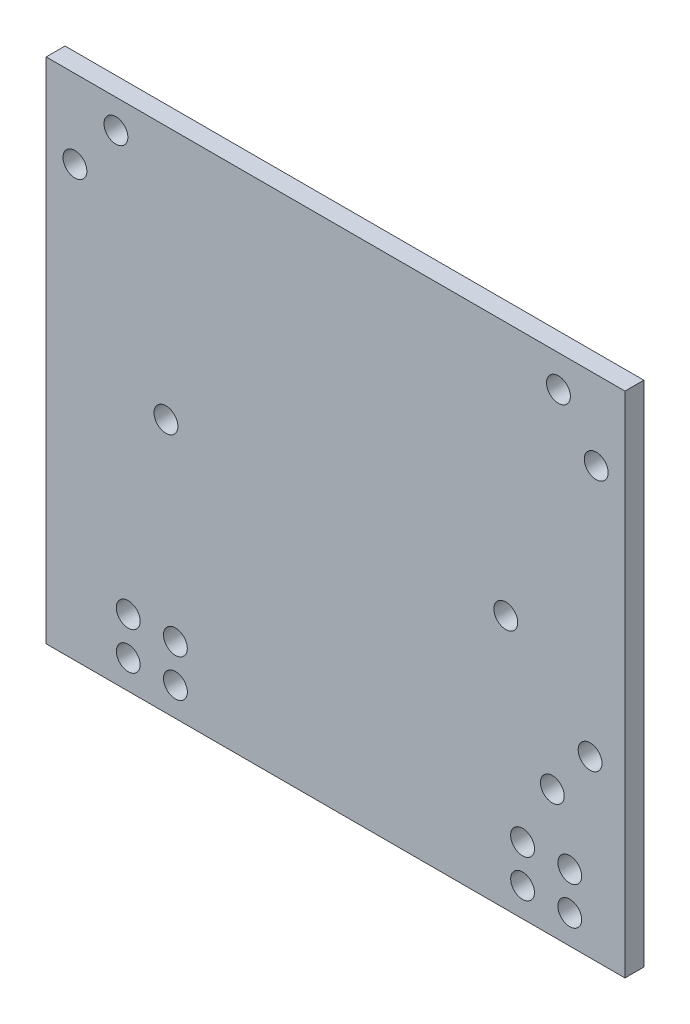
ISO-10303-21;
HEADER;
FILE_DESCRIPTION(('STEP AP214'),'2;1');
FILE_NAME('part.step','',(''),(''),'','','');
FILE_SCHEMA(('AUTOMOTIVE_DESIGN { 1 0 10303 214 1 1 1 1 }'));
ENDSEC;
DATA;
#1=APPLICATION_CONTEXT('core data for automotive mechanical design processes');
#2=APPLICATION_PROTOCOL_DEFINITION('international standard','automotive_design',2000,#1);
#3=PRODUCT_CONTEXT('',#1,'mechanical');
#4=PRODUCT('Part','Part','',(#3));
#5=PRODUCT_RELATED_PRODUCT_CATEGORY('part','',(#4));
#6=PRODUCT_DEFINITION_FORMATION('','',#4);
#7=PRODUCT_DEFINITION_CONTEXT('part definition',#1,'design');
#8=PRODUCT_DEFINITION('design','',#6,#7);
#9=PRODUCT_DEFINITION_SHAPE('','',#8);
#10=(LENGTH_UNIT() NAMED_UNIT(*) SI_UNIT(.MILLI.,.METRE.));
#11=(NAMED_UNIT(*) PLANE_ANGLE_UNIT() SI_UNIT($,.RADIAN.));
#12=(NAMED_UNIT(*) SI_UNIT($,.STERADIAN.) SOLID_ANGLE_UNIT());
#13=UNCERTAINTY_MEASURE_WITH_UNIT(LENGTH_MEASURE(1.E-05),#10,'distance_accuracy_value','');
#14=(GEOMETRIC_REPRESENTATION_CONTEXT(3) GLOBAL_UNCERTAINTY_ASSIGNED_CONTEXT((#13)) GLOBAL_UNIT_ASSIGNED_CONTEXT((#10,
#11,#12)) REPRESENTATION_CONTEXT('',''));
#15=CARTESIAN_POINT('',(0.,0.,0.));
#16=DIRECTION('',(0.,0.,1.));
#17=DIRECTION('',(1.,0.,0.));
#18=AXIS2_PLACEMENT_3D('',#15,#16,#17);
#19=CARTESIAN_POINT('',(0.,0.,-6.35));
#20=DIRECTION('',(0.,0.,1.));
#21=DIRECTION('',(-1.,0.,0.));
#22=AXIS2_PLACEMENT_3D('',#19,#20,#21);
#23=PLANE('',#22);
#24=CARTESIAN_POINT('',(889.644786871224,226.95326558584,-6.35));
#25=DIRECTION('',(0.,0.,1.));
#26=DIRECTION('',(1.,0.,0.));
#27=AXIS2_PLACEMENT_3D('',#24,#25,#26);
#28=CIRCLE('',#27,4.00150000000001);
#29=CARTESIAN_POINT('',(893.646286871224,226.95326558584,-6.35));
#30=VERTEX_POINT('',#29);
#31=EDGE_CURVE('E176',#30,#30,#28,.T.);
#32=ORIENTED_EDGE('',*,*,#31,.T.);
#33=EDGE_LOOP('',(#32));
#34=FACE_BOUND('',#33,.T.);
#35=CARTESIAN_POINT('',(1032.28657507432,260.04946558584,-6.35));
#36=DIRECTION('',(0.,0.,1.));
#37=DIRECTION('',(1.,0.,0.));
#38=AXIS2_PLACEMENT_3D('',#35,#36,#37);
#39=CIRCLE('',#38,4.00149999999977);
#40=CARTESIAN_POINT('',(1036.28807507432,260.04946558584,-6.35));
#41=VERTEX_POINT('',#40);
#42=EDGE_CURVE('E205',#41,#41,#39,.T.);
#43=ORIENTED_EDGE('',*,*,#42,.T.);
#44=EDGE_LOOP('',(#43));
#45=FACE_BOUND('',#44,.T.);
#46=CARTESIAN_POINT('',(1044.98657507432,275.92446558584,-6.35));
#47=DIRECTION('',(0.,0.,1.));
#48=DIRECTION('',(1.,0.,0.));
#49=AXIS2_PLACEMENT_3D('',#46,#47,#48);
#50=CIRCLE('',#49,4.00149999999977);
#51=CARTESIAN_POINT('',(1048.98807507432,275.92446558584,-6.35));
#52=VERTEX_POINT('',#51);
#53=EDGE_CURVE('E179',#52,#52,#50,.T.);
#54=ORIENTED_EDGE('',*,*,#53,.T.);
#55=EDGE_LOOP('',(#54));
#56=FACE_BOUND('',#55,.T.);
#57=CARTESIAN_POINT('',(1038.1549594132,239.65326558584,-6.35));
#58=DIRECTION('',(0.,0.,1.));
#59=DIRECTION('',(1.,0.,0.));
#60=AXIS2_PLACEMENT_3D('',#57,#58,#59);
#61=CIRCLE('',#60,4.00149999999978);
#62=CARTESIAN_POINT('',(1042.1564594132,239.65326558584,-6.35));
#63=VERTEX_POINT('',#62);
#64=EDGE_CURVE('E186',#63,#63,#61,.T.);
#65=ORIENTED_EDGE('',*,*,#64,.T.);
#66=EDGE_LOOP('',(#65));
#67=FACE_BOUND('',#66,.T.);
#68=CARTESIAN_POINT('',(1022.2799594132,226.95326558584,-6.35));
#69=DIRECTION('',(0.,0.,1.));
#70=DIRECTION('',(1.,0.,0.));
#71=AXIS2_PLACEMENT_3D('',#68,#69,#70);
#72=CIRCLE('',#71,4.00149999999978);
#73=CARTESIAN_POINT('',(1026.2814594132,226.95326558584,-6.35));
#74=VERTEX_POINT('',#73);
#75=EDGE_CURVE('E192',#74,#74,#72,.T.);
#76=ORIENTED_EDGE('',*,*,#75,.T.);
#77=EDGE_LOOP('',(#76));
#78=FACE_BOUND('',#77,.T.);
#79=CARTESIAN_POINT('',(905.519786871224,239.65326558584,-6.35));
#80=DIRECTION('',(0.,0.,1.));
#81=DIRECTION('',(1.,0.,0.));
#82=AXIS2_PLACEMENT_3D('',#79,#80,#81);
#83=CIRCLE('',#82,4.00150000000001);
#84=CARTESIAN_POINT('',(909.521286871224,239.65326558584,-6.35));
#85=VERTEX_POINT('',#84);
#86=EDGE_CURVE('E198',#85,#85,#83,.T.);
#87=ORIENTED_EDGE('',*,*,#86,.T.);
#88=EDGE_LOOP('',(#87));
#89=FACE_BOUND('',#88,.T.);
#90=DIRECTION('',(0.,-1.,0.));
#91=VECTOR('',#90,1.);
#92=CARTESIAN_POINT('',(862.044789876079,217.278265585855,-6.35));
#93=LINE('',#92,#91);
#94=CARTESIAN_POINT('',(862.044789876079,388.233207524856,-6.35));
#95=VERTEX_POINT('',#94);
#96=CARTESIAN_POINT('',(862.044789876079,217.278265585855,-6.35));
#97=VERTEX_POINT('',#96);
#98=EDGE_CURVE('E99',#95,#97,#93,.T.);
#99=ORIENTED_EDGE('',*,*,#98,.F.);
#100=DIRECTION('',(-1.,0.,0.));
#101=VECTOR('',#100,1.);
#102=CARTESIAN_POINT('',(862.044789876079,388.233207524856,-6.35));
#103=LINE('',#102,#101);
#104=CARTESIAN_POINT('',(1056.7178425293,388.233207524856,-6.35));
#105=VERTEX_POINT('',#104);
#106=EDGE_CURVE('E102',#105,#95,#103,.T.);
#107=ORIENTED_EDGE('',*,*,#106,.F.);
#108=DIRECTION('',(0.,1.,0.));
#109=VECTOR('',#108,1.);
#110=CARTESIAN_POINT('',(1056.7178425293,217.278265585855,-6.35));
#111=LINE('',#110,#109);
#112=CARTESIAN_POINT('',(1056.7178425293,217.278265585855,-6.35));
#113=VERTEX_POINT('',#112);
#114=EDGE_CURVE('E90',#113,#105,#111,.T.);
#115=ORIENTED_EDGE('',*,*,#114,.F.);
#116=DIRECTION('',(1.,0.,0.));
#117=VECTOR('',#116,1.);
#118=CARTESIAN_POINT('',(862.044789876079,217.278265585855,-6.35));
#119=LINE('',#118,#117);
#120=EDGE_CURVE('E95',#97,#113,#119,.T.);
#121=ORIENTED_EDGE('',*,*,#120,.F.);
#122=EDGE_LOOP('',(#99,#107,#115,#121));
#123=FACE_BOUND('',#122,.T.);
#124=CARTESIAN_POINT('',(1022.27995941321,239.653265585854,-6.35));
#125=DIRECTION('',(0.,0.,1.));
#126=DIRECTION('',(1.,0.,0.));
#127=AXIS2_PLACEMENT_3D('',#124,#125,#126);
#128=CIRCLE('',#127,4.01269999999996);
#129=CARTESIAN_POINT('',(1026.29265941321,239.653265585854,-6.35));
#130=VERTEX_POINT('',#129);
#131=EDGE_CURVE('E111',#130,#130,#128,.T.);
#132=ORIENTED_EDGE('',*,*,#131,.T.);
#133=EDGE_LOOP('',(#132));
#134=FACE_BOUND('',#133,.T.);
#135=CARTESIAN_POINT('',(1038.15495941321,226.953265585854,-6.35));
#136=DIRECTION('',(0.,0.,1.));
#137=DIRECTION('',(1.,0.,0.));
#138=AXIS2_PLACEMENT_3D('',#135,#136,#137);
#139=CIRCLE('',#138,4.01269999999996);
#140=CARTESIAN_POINT('',(1042.16765941321,226.953265585854,-6.35));
#141=VERTEX_POINT('',#140);
#142=EDGE_CURVE('E122',#141,#141,#139,.T.);
#143=ORIENTED_EDGE('',*,*,#142,.T.);
#144=EDGE_LOOP('',(#143));
#145=FACE_BOUND('',#144,.T.);
#146=CARTESIAN_POINT('',(889.644786871235,239.653265585855,-6.35));
#147=DIRECTION('',(0.,0.,1.));
#148=DIRECTION('',(1.,0.,0.));
#149=AXIS2_PLACEMENT_3D('',#146,#147,#148);
#150=CIRCLE('',#149,4.01270000000008);
#151=CARTESIAN_POINT('',(893.657486871235,239.653265585855,-6.35));
#152=VERTEX_POINT('',#151);
#153=EDGE_CURVE('E128',#152,#152,#150,.T.);
#154=ORIENTED_EDGE('',*,*,#153,.T.);
#155=EDGE_LOOP('',(#154));
#156=FACE_BOUND('',#155,.T.);
#157=CARTESIAN_POINT('',(1034.3338599261,377.480941448401,-6.35));
#158=DIRECTION('',(0.,0.,1.));
#159=DIRECTION('',(1.,0.,0.));
#160=AXIS2_PLACEMENT_3D('',#157,#158,#159);
#161=CIRCLE('',#160,4.01270000000019);
#162=CARTESIAN_POINT('',(1038.3465599261,377.480941448401,-6.35));
#163=VERTEX_POINT('',#162);
#164=EDGE_CURVE('E134',#163,#163,#161,.T.);
#165=ORIENTED_EDGE('',*,*,#164,.T.);
#166=EDGE_LOOP('',(#165));
#167=FACE_BOUND('',#166,.T.);
#168=CARTESIAN_POINT('',(1047.0428425293,361.613131700632,-6.35));
#169=DIRECTION('',(0.,0.,1.));
#170=DIRECTION('',(1.,0.,0.));
#171=AXIS2_PLACEMENT_3D('',#168,#169,#170);
#172=CIRCLE('',#171,4.01270000000019);
#173=CARTESIAN_POINT('',(1051.0555425293,361.613131700632,-6.35));
#174=VERTEX_POINT('',#173);
#175=EDGE_CURVE('E140',#174,#174,#172,.T.);
#176=ORIENTED_EDGE('',*,*,#175,.T.);
#177=EDGE_LOOP('',(#176));
#178=FACE_BOUND('',#177,.T.);
#179=CARTESIAN_POINT('',(871.719789876079,361.793284425073,-6.35));
#180=DIRECTION('',(0.,0.,1.));
#181=DIRECTION('',(1.,0.,0.));
#182=AXIS2_PLACEMENT_3D('',#179,#180,#181);
#183=CIRCLE('',#182,4.01270000000008);
#184=CARTESIAN_POINT('',(875.732489876079,361.793284425073,-6.35));
#185=VERTEX_POINT('',#184);
#186=EDGE_CURVE('E146',#185,#185,#183,.T.);
#187=ORIENTED_EDGE('',*,*,#186,.T.);
#188=EDGE_LOOP('',(#187));
#189=FACE_BOUND('',#188,.T.);
#190=CARTESIAN_POINT('',(885.505258453761,378.558207524856,-6.35));
#191=DIRECTION('',(0.,0.,1.));
#192=DIRECTION('',(1.,0.,0.));
#193=AXIS2_PLACEMENT_3D('',#190,#191,#192);
#194=CIRCLE('',#193,4.01270000000008);
#195=CARTESIAN_POINT('',(889.517958453761,378.558207524856,-6.35));
#196=VERTEX_POINT('',#195);
#197=EDGE_CURVE('E152',#196,#196,#194,.T.);
#198=ORIENTED_EDGE('',*,*,#197,.T.);
#199=EDGE_LOOP('',(#198));
#200=FACE_BOUND('',#199,.T.);
#201=CARTESIAN_POINT('',(905.519786871235,226.953265585855,-6.35));
#202=DIRECTION('',(0.,0.,1.));
#203=DIRECTION('',(1.,0.,0.));
#204=AXIS2_PLACEMENT_3D('',#201,#202,#203);
#205=CIRCLE('',#204,4.01270000000008);
#206=CARTESIAN_POINT('',(909.532486871235,226.953265585855,-6.35));
#207=VERTEX_POINT('',#206);
#208=EDGE_CURVE('E158',#207,#207,#205,.T.);
#209=ORIENTED_EDGE('',*,*,#208,.T.);
#210=EDGE_LOOP('',(#209));
#211=FACE_BOUND('',#210,.T.);
#212=CARTESIAN_POINT('',(902.338636268682,302.755736555355,-6.35));
#213=DIRECTION('',(0.,0.,1.));
#214=DIRECTION('',(1.,0.,0.));
#215=AXIS2_PLACEMENT_3D('',#212,#213,#214);
#216=CIRCLE('',#215,4.01270000000008);
#217=CARTESIAN_POINT('',(906.351336268682,302.755736555355,-6.35));
#218=VERTEX_POINT('',#217);
#219=EDGE_CURVE('E164',#218,#218,#216,.T.);
#220=ORIENTED_EDGE('',*,*,#219,.T.);
#221=EDGE_LOOP('',(#220));
#222=FACE_BOUND('',#221,.T.);
#223=CARTESIAN_POINT('',(1016.63863626868,302.755736555355,-6.35));
#224=DIRECTION('',(0.,0.,1.));
#225=DIRECTION('',(-1.,0.,0.));
#226=AXIS2_PLACEMENT_3D('',#223,#224,#225);
#227=CIRCLE('',#226,4.01270000000019);
#228=CARTESIAN_POINT('',(1012.62593626868,302.755736555355,-6.35));
#229=VERTEX_POINT('',#228);
#230=EDGE_CURVE('E170',#229,#229,#227,.T.);
#231=ORIENTED_EDGE('',*,*,#230,.T.);
#232=EDGE_LOOP('',(#231));
#233=FACE_BOUND('',#232,.T.);
#234=ADVANCED_FACE('F43',(#34,#45,#56,#67,#78,#89,#123,#134,#145,#156,#167,#178,#189,#200,#211,
#222,#233),#23,.F.);
#235=CARTESIAN_POINT('',(0.,0.,0.));
#236=DIRECTION('',(0.,0.,1.));
#237=DIRECTION('',(-1.,0.,0.));
#238=AXIS2_PLACEMENT_3D('',#235,#236,#237);
#239=PLANE('',#238);
#240=CARTESIAN_POINT('',(889.644786871224,226.95326558584,0.));
#241=DIRECTION('',(0.,0.,1.));
#242=DIRECTION('',(1.,0.,0.));
#243=AXIS2_PLACEMENT_3D('',#240,#241,#242);
#244=CIRCLE('',#243,4.00150000000001);
#245=CARTESIAN_POINT('',(893.646286871224,226.95326558584,0.));
#246=VERTEX_POINT('',#245);
#247=EDGE_CURVE('E204',#246,#246,#244,.T.);
#248=ORIENTED_EDGE('',*,*,#247,.F.);
#249=EDGE_LOOP('',(#248));
#250=FACE_BOUND('',#249,.T.);
#251=CARTESIAN_POINT('',(1032.28657507432,260.04946558584,0.));
#252=DIRECTION('',(0.,0.,1.));
#253=DIRECTION('',(1.,0.,0.));
#254=AXIS2_PLACEMENT_3D('',#251,#252,#253);
#255=CIRCLE('',#254,4.00149999999977);
#256=CARTESIAN_POINT('',(1036.28807507432,260.04946558584,0.));
#257=VERTEX_POINT('',#256);
#258=EDGE_CURVE('E183',#257,#257,#255,.T.);
#259=ORIENTED_EDGE('',*,*,#258,.F.);
#260=EDGE_LOOP('',(#259));
#261=FACE_BOUND('',#260,.T.);
#262=CARTESIAN_POINT('',(1044.98657507432,275.92446558584,0.));
#263=DIRECTION('',(0.,0.,1.));
#264=DIRECTION('',(1.,0.,0.));
#265=AXIS2_PLACEMENT_3D('',#262,#263,#264);
#266=CIRCLE('',#265,4.00149999999977);
#267=CARTESIAN_POINT('',(1048.98807507432,275.92446558584,0.));
#268=VERTEX_POINT('',#267);
#269=EDGE_CURVE('E182',#268,#268,#266,.T.);
#270=ORIENTED_EDGE('',*,*,#269,.F.);
#271=EDGE_LOOP('',(#270));
#272=FACE_BOUND('',#271,.T.);
#273=CARTESIAN_POINT('',(1038.1549594132,239.65326558584,0.));
#274=DIRECTION('',(0.,0.,1.));
#275=DIRECTION('',(1.,0.,0.));
#276=AXIS2_PLACEMENT_3D('',#273,#274,#275);
#277=CIRCLE('',#276,4.00149999999978);
#278=CARTESIAN_POINT('',(1042.1564594132,239.65326558584,0.));
#279=VERTEX_POINT('',#278);
#280=EDGE_CURVE('E189',#279,#279,#277,.T.);
#281=ORIENTED_EDGE('',*,*,#280,.F.);
#282=EDGE_LOOP('',(#281));
#283=FACE_BOUND('',#282,.T.);
#284=CARTESIAN_POINT('',(1022.2799594132,226.95326558584,0.));
#285=DIRECTION('',(0.,0.,1.));
#286=DIRECTION('',(1.,0.,0.));
#287=AXIS2_PLACEMENT_3D('',#284,#285,#286);
#288=CIRCLE('',#287,4.00149999999978);
#289=CARTESIAN_POINT('',(1026.2814594132,226.95326558584,0.));
#290=VERTEX_POINT('',#289);
#291=EDGE_CURVE('E195',#290,#290,#288,.T.);
#292=ORIENTED_EDGE('',*,*,#291,.F.);
#293=EDGE_LOOP('',(#292));
#294=FACE_BOUND('',#293,.T.);
#295=CARTESIAN_POINT('',(905.519786871224,239.65326558584,0.));
#296=DIRECTION('',(0.,0.,1.));
#297=DIRECTION('',(1.,0.,0.));
#298=AXIS2_PLACEMENT_3D('',#295,#296,#297);
#299=CIRCLE('',#298,4.00150000000001);
#300=CARTESIAN_POINT('',(909.521286871224,239.65326558584,0.));
#301=VERTEX_POINT('',#300);
#302=EDGE_CURVE('E201',#301,#301,#299,.T.);
#303=ORIENTED_EDGE('',*,*,#302,.F.);
#304=EDGE_LOOP('',(#303));
#305=FACE_BOUND('',#304,.T.);
#306=CARTESIAN_POINT('',(902.338636268682,302.755736555355,0.));
#307=DIRECTION('',(0.,0.,1.));
#308=DIRECTION('',(1.,0.,0.));
#309=AXIS2_PLACEMENT_3D('',#306,#307,#308);
#310=CIRCLE('',#309,4.01270000000008);
#311=CARTESIAN_POINT('',(906.351336268682,302.755736555355,0.));
#312=VERTEX_POINT('',#311);
#313=EDGE_CURVE('E167',#312,#312,#310,.T.);
#314=ORIENTED_EDGE('',*,*,#313,.F.);
#315=EDGE_LOOP('',(#314));
#316=FACE_BOUND('',#315,.T.);
#317=CARTESIAN_POINT('',(885.505258453761,378.558207524856,0.));
#318=DIRECTION('',(0.,0.,1.));
#319=DIRECTION('',(1.,0.,0.));
#320=AXIS2_PLACEMENT_3D('',#317,#318,#319);
#321=CIRCLE('',#320,4.01270000000008);
#322=CARTESIAN_POINT('',(889.517958453761,378.558207524856,0.));
#323=VERTEX_POINT('',#322);
#324=EDGE_CURVE('E155',#323,#323,#321,.T.);
#325=ORIENTED_EDGE('',*,*,#324,.F.);
#326=EDGE_LOOP('',(#325));
#327=FACE_BOUND('',#326,.T.);
#328=CARTESIAN_POINT('',(1047.0428425293,361.613131700632,0.));
#329=DIRECTION('',(0.,0.,1.));
#330=DIRECTION('',(1.,0.,0.));
#331=AXIS2_PLACEMENT_3D('',#328,#329,#330);
#332=CIRCLE('',#331,4.01270000000019);
#333=CARTESIAN_POINT('',(1051.0555425293,361.613131700632,0.));
#334=VERTEX_POINT('',#333);
#335=EDGE_CURVE('E143',#334,#334,#332,.T.);
#336=ORIENTED_EDGE('',*,*,#335,.F.);
#337=EDGE_LOOP('',(#336));
#338=FACE_BOUND('',#337,.T.);
#339=CARTESIAN_POINT('',(889.644786871235,239.653265585855,0.));
#340=DIRECTION('',(0.,0.,1.));
#341=DIRECTION('',(1.,0.,0.));
#342=AXIS2_PLACEMENT_3D('',#339,#340,#341);
#343=CIRCLE('',#342,4.01270000000008);
#344=CARTESIAN_POINT('',(893.657486871235,239.653265585855,0.));
#345=VERTEX_POINT('',#344);
#346=EDGE_CURVE('E131',#345,#345,#343,.T.);
#347=ORIENTED_EDGE('',*,*,#346,.F.);
#348=EDGE_LOOP('',(#347));
#349=FACE_BOUND('',#348,.T.);
#350=CARTESIAN_POINT('',(1022.27995941321,239.653265585854,0.));
#351=DIRECTION('',(0.,0.,1.));
#352=DIRECTION('',(1.,0.,0.));
#353=AXIS2_PLACEMENT_3D('',#350,#351,#352);
#354=CIRCLE('',#353,4.01269999999996);
#355=CARTESIAN_POINT('',(1026.29265941321,239.653265585854,0.));
#356=VERTEX_POINT('',#355);
#357=EDGE_CURVE('E119',#356,#356,#354,.T.);
#358=ORIENTED_EDGE('',*,*,#357,.F.);
#359=EDGE_LOOP('',(#358));
#360=FACE_BOUND('',#359,.T.);
#361=DIRECTION('',(0.,-1.,0.));
#362=VECTOR('',#361,1.);
#363=CARTESIAN_POINT('',(862.044789876079,217.278265585855,0.));
#364=LINE('',#363,#362);
#365=CARTESIAN_POINT('',(862.044789876079,388.233207524856,0.));
#366=VERTEX_POINT('',#365);
#367=CARTESIAN_POINT('',(862.044789876079,217.278265585855,0.));
#368=VERTEX_POINT('',#367);
#369=EDGE_CURVE('E107',#366,#368,#364,.T.);
#370=ORIENTED_EDGE('',*,*,#369,.T.);
#371=DIRECTION('',(1.,0.,0.));
#372=VECTOR('',#371,1.);
#373=CARTESIAN_POINT('',(862.044789876079,217.278265585855,0.));
#374=LINE('',#373,#372);
#375=CARTESIAN_POINT('',(1056.7178425293,217.278265585855,0.));
#376=VERTEX_POINT('',#375);
#377=EDGE_CURVE('E110',#368,#376,#374,.T.);
#378=ORIENTED_EDGE('',*,*,#377,.T.);
#379=DIRECTION('',(0.,1.,0.));
#380=VECTOR('',#379,1.);
#381=CARTESIAN_POINT('',(1056.7178425293,217.278265585855,0.));
#382=LINE('',#381,#380);
#383=CARTESIAN_POINT('',(1056.7178425293,388.233207524856,0.));
#384=VERTEX_POINT('',#383);
#385=EDGE_CURVE('E93',#376,#384,#382,.T.);
#386=ORIENTED_EDGE('',*,*,#385,.T.);
#387=DIRECTION('',(-1.,0.,0.));
#388=VECTOR('',#387,1.);
#389=CARTESIAN_POINT('',(862.044789876079,388.233207524856,0.));
#390=LINE('',#389,#388);
#391=EDGE_CURVE('E114',#384,#366,#390,.T.);
#392=ORIENTED_EDGE('',*,*,#391,.T.);
#393=EDGE_LOOP('',(#370,#378,#386,#392));
#394=FACE_BOUND('',#393,.T.);
#395=CARTESIAN_POINT('',(1038.15495941321,226.953265585854,0.));
#396=DIRECTION('',(0.,0.,1.));
#397=DIRECTION('',(1.,0.,0.));
#398=AXIS2_PLACEMENT_3D('',#395,#396,#397);
#399=CIRCLE('',#398,4.01269999999996);
#400=CARTESIAN_POINT('',(1042.16765941321,226.953265585854,0.));
#401=VERTEX_POINT('',#400);
#402=EDGE_CURVE('E125',#401,#401,#399,.T.);
#403=ORIENTED_EDGE('',*,*,#402,.F.);
#404=EDGE_LOOP('',(#403));
#405=FACE_BOUND('',#404,.T.);
#406=CARTESIAN_POINT('',(1034.3338599261,377.480941448401,0.));
#407=DIRECTION('',(0.,0.,1.));
#408=DIRECTION('',(1.,0.,0.));
#409=AXIS2_PLACEMENT_3D('',#406,#407,#408);
#410=CIRCLE('',#409,4.01270000000019);
#411=CARTESIAN_POINT('',(1038.3465599261,377.480941448401,0.));
#412=VERTEX_POINT('',#411);
#413=EDGE_CURVE('E137',#412,#412,#410,.T.);
#414=ORIENTED_EDGE('',*,*,#413,.F.);
#415=EDGE_LOOP('',(#414));
#416=FACE_BOUND('',#415,.T.);
#417=CARTESIAN_POINT('',(871.719789876079,361.793284425073,0.));
#418=DIRECTION('',(0.,0.,1.));
#419=DIRECTION('',(1.,0.,0.));
#420=AXIS2_PLACEMENT_3D('',#417,#418,#419);
#421=CIRCLE('',#420,4.01270000000008);
#422=CARTESIAN_POINT('',(875.732489876079,361.793284425073,0.));
#423=VERTEX_POINT('',#422);
#424=EDGE_CURVE('E149',#423,#423,#421,.T.);
#425=ORIENTED_EDGE('',*,*,#424,.F.);
#426=EDGE_LOOP('',(#425));
#427=FACE_BOUND('',#426,.T.);
#428=CARTESIAN_POINT('',(905.519786871235,226.953265585855,0.));
#429=DIRECTION('',(0.,0.,1.));
#430=DIRECTION('',(1.,0.,0.));
#431=AXIS2_PLACEMENT_3D('',#428,#429,#430);
#432=CIRCLE('',#431,4.01270000000008);
#433=CARTESIAN_POINT('',(909.532486871235,226.953265585855,0.));
#434=VERTEX_POINT('',#433);
#435=EDGE_CURVE('E161',#434,#434,#432,.T.);
#436=ORIENTED_EDGE('',*,*,#435,.F.);
#437=EDGE_LOOP('',(#436));
#438=FACE_BOUND('',#437,.T.);
#439=CARTESIAN_POINT('',(1016.63863626868,302.755736555355,0.));
#440=DIRECTION('',(0.,0.,1.));
#441=DIRECTION('',(-1.,0.,0.));
#442=AXIS2_PLACEMENT_3D('',#439,#440,#441);
#443=CIRCLE('',#442,4.01270000000019);
#444=CARTESIAN_POINT('',(1012.62593626868,302.755736555355,0.));
#445=VERTEX_POINT('',#444);
#446=EDGE_CURVE('E173',#445,#445,#443,.T.);
#447=ORIENTED_EDGE('',*,*,#446,.F.);
#448=EDGE_LOOP('',(#447));
#449=FACE_BOUND('',#448,.T.);
#450=ADVANCED_FACE('F224',(#250,#261,#272,#283,#294,#305,#316,#327,#338,#349,#360,#394,#405,
#416,#427,#438,#449),#239,.T.);
#451=CARTESIAN_POINT('',(862.044789876079,217.278265585855,-6.35));
#452=DIRECTION('',(1.,0.,0.));
#453=DIRECTION('',(0.,0.,1.));
#454=AXIS2_PLACEMENT_3D('',#451,#452,#453);
#455=PLANE('',#454);
#456=ORIENTED_EDGE('',*,*,#369,.F.);
#457=DIRECTION('',(0.,0.,1.));
#458=VECTOR('',#457,1.);
#459=CARTESIAN_POINT('',(862.044789876079,388.233207524856,-6.35));
#460=LINE('',#459,#458);
#461=EDGE_CURVE('E60',#95,#366,#460,.T.);
#462=ORIENTED_EDGE('',*,*,#461,.F.);
#463=ORIENTED_EDGE('',*,*,#98,.T.);
#464=DIRECTION('',(0.,0.,1.));
#465=VECTOR('',#464,1.);
#466=CARTESIAN_POINT('',(862.044789876079,217.278265585855,-6.35));
#467=LINE('',#466,#465);
#468=EDGE_CURVE('E11',#97,#368,#467,.T.);
#469=ORIENTED_EDGE('',*,*,#468,.T.);
#470=EDGE_LOOP('',(#456,#462,#463,#469));
#471=FACE_BOUND('',#470,.T.);
#472=ADVANCED_FACE('F45',(#471),#455,.F.);
#473=CARTESIAN_POINT('',(862.044789876079,217.278265585855,-6.35));
#474=DIRECTION('',(0.,1.,0.));
#475=DIRECTION('',(0.,0.,-1.));
#476=AXIS2_PLACEMENT_3D('',#473,#474,#475);
#477=PLANE('',#476);
#478=ORIENTED_EDGE('',*,*,#377,.F.);
#479=ORIENTED_EDGE('',*,*,#468,.F.);
#480=ORIENTED_EDGE('',*,*,#120,.T.);
#481=DIRECTION('',(0.,0.,1.));
#482=VECTOR('',#481,1.);
#483=CARTESIAN_POINT('',(1056.7178425293,217.278265585855,-6.35));
#484=LINE('',#483,#482);
#485=EDGE_CURVE('E52',#113,#376,#484,.T.);
#486=ORIENTED_EDGE('',*,*,#485,.T.);
#487=EDGE_LOOP('',(#478,#479,#480,#486));
#488=FACE_BOUND('',#487,.T.);
#489=ADVANCED_FACE('F96',(#488),#477,.F.);
#490=CARTESIAN_POINT('',(1056.7178425293,217.278265585855,-6.35));
#491=DIRECTION('',(-1.,0.,0.));
#492=DIRECTION('',(0.,0.,-1.));
#493=AXIS2_PLACEMENT_3D('',#490,#491,#492);
#494=PLANE('',#493);
#495=ORIENTED_EDGE('',*,*,#385,.F.);
#496=ORIENTED_EDGE('',*,*,#485,.F.);
#497=ORIENTED_EDGE('',*,*,#114,.T.);
#498=DIRECTION('',(0.,0.,1.));
#499=VECTOR('',#498,1.);
#500=CARTESIAN_POINT('',(1056.7178425293,388.233207524856,-6.35));
#501=LINE('',#500,#499);
#502=EDGE_CURVE('E76',#105,#384,#501,.T.);
#503=ORIENTED_EDGE('',*,*,#502,.T.);
#504=EDGE_LOOP('',(#495,#496,#497,#503));
#505=FACE_BOUND('',#504,.T.);
#506=ADVANCED_FACE('F88',(#505),#494,.F.);
#507=CARTESIAN_POINT('',(862.044789876079,388.233207524856,-6.35));
#508=DIRECTION('',(0.,-1.,0.));
#509=DIRECTION('',(0.,0.,1.));
#510=AXIS2_PLACEMENT_3D('',#507,#508,#509);
#511=PLANE('',#510);
#512=ORIENTED_EDGE('',*,*,#391,.F.);
#513=ORIENTED_EDGE('',*,*,#502,.F.);
#514=ORIENTED_EDGE('',*,*,#106,.T.);
#515=ORIENTED_EDGE('',*,*,#461,.T.);
#516=EDGE_LOOP('',(#512,#513,#514,#515));
#517=FACE_BOUND('',#516,.T.);
#518=ADVANCED_FACE('F284',(#517),#511,.F.);
#519=CARTESIAN_POINT('',(1022.27995941321,239.653265585854,-6.35));
#520=DIRECTION('',(0.,0.,1.));
#521=DIRECTION('',(-1.,0.,0.));
#522=AXIS2_PLACEMENT_3D('',#519,#520,#521);
#523=CYLINDRICAL_SURFACE('',#522,4.01269999999996);
#524=ORIENTED_EDGE('',*,*,#131,.F.);
#525=EDGE_LOOP('',(#524));
#526=FACE_BOUND('',#525,.T.);
#527=ORIENTED_EDGE('',*,*,#357,.T.);
#528=EDGE_LOOP('',(#527));
#529=FACE_BOUND('',#528,.T.);
#530=ADVANCED_FACE('F281',(#526,#529),#523,.F.);
#531=CARTESIAN_POINT('',(1038.15495941321,226.953265585854,-6.35));
#532=DIRECTION('',(0.,0.,1.));
#533=DIRECTION('',(-1.,0.,0.));
#534=AXIS2_PLACEMENT_3D('',#531,#532,#533);
#535=CYLINDRICAL_SURFACE('',#534,4.01269999999996);
#536=ORIENTED_EDGE('',*,*,#142,.F.);
#537=EDGE_LOOP('',(#536));
#538=FACE_BOUND('',#537,.T.);
#539=ORIENTED_EDGE('',*,*,#402,.T.);
#540=EDGE_LOOP('',(#539));
#541=FACE_BOUND('',#540,.T.);
#542=ADVANCED_FACE('F324',(#538,#541),#535,.F.);
#543=CARTESIAN_POINT('',(889.644786871235,239.653265585855,-6.35));
#544=DIRECTION('',(0.,0.,1.));
#545=DIRECTION('',(-1.,0.,0.));
#546=AXIS2_PLACEMENT_3D('',#543,#544,#545);
#547=CYLINDRICAL_SURFACE('',#546,4.01270000000008);
#548=ORIENTED_EDGE('',*,*,#153,.F.);
#549=EDGE_LOOP('',(#548));
#550=FACE_BOUND('',#549,.T.);
#551=ORIENTED_EDGE('',*,*,#346,.T.);
#552=EDGE_LOOP('',(#551));
#553=FACE_BOUND('',#552,.T.);
#554=ADVANCED_FACE('F333',(#550,#553),#547,.F.);
#555=CARTESIAN_POINT('',(1034.3338599261,377.480941448401,-6.35));
#556=DIRECTION('',(0.,0.,1.));
#557=DIRECTION('',(-1.,0.,0.));
#558=AXIS2_PLACEMENT_3D('',#555,#556,#557);
#559=CYLINDRICAL_SURFACE('',#558,4.01270000000019);
#560=ORIENTED_EDGE('',*,*,#164,.F.);
#561=EDGE_LOOP('',(#560));
#562=FACE_BOUND('',#561,.T.);
#563=ORIENTED_EDGE('',*,*,#413,.T.);
#564=EDGE_LOOP('',(#563));
#565=FACE_BOUND('',#564,.T.);
#566=ADVANCED_FACE('F342',(#562,#565),#559,.F.);
#567=CARTESIAN_POINT('',(1047.0428425293,361.613131700632,-6.35));
#568=DIRECTION('',(0.,0.,1.));
#569=DIRECTION('',(-1.,0.,0.));
#570=AXIS2_PLACEMENT_3D('',#567,#568,#569);
#571=CYLINDRICAL_SURFACE('',#570,4.01270000000019);
#572=ORIENTED_EDGE('',*,*,#175,.F.);
#573=EDGE_LOOP('',(#572));
#574=FACE_BOUND('',#573,.T.);
#575=ORIENTED_EDGE('',*,*,#335,.T.);
#576=EDGE_LOOP('',(#575));
#577=FACE_BOUND('',#576,.T.);
#578=ADVANCED_FACE('F352',(#574,#577),#571,.F.);
#579=CARTESIAN_POINT('',(871.719789876079,361.793284425073,-6.35));
#580=DIRECTION('',(0.,0.,1.));
#581=DIRECTION('',(-1.,0.,0.));
#582=AXIS2_PLACEMENT_3D('',#579,#580,#581);
#583=CYLINDRICAL_SURFACE('',#582,4.01270000000008);
#584=ORIENTED_EDGE('',*,*,#186,.F.);
#585=EDGE_LOOP('',(#584));
#586=FACE_BOUND('',#585,.T.);
#587=ORIENTED_EDGE('',*,*,#424,.T.);
#588=EDGE_LOOP('',(#587));
#589=FACE_BOUND('',#588,.T.);
#590=ADVANCED_FACE('F362',(#586,#589),#583,.F.);
#591=CARTESIAN_POINT('',(885.505258453761,378.558207524856,-6.35));
#592=DIRECTION('',(0.,0.,1.));
#593=DIRECTION('',(-1.,0.,0.));
#594=AXIS2_PLACEMENT_3D('',#591,#592,#593);
#595=CYLINDRICAL_SURFACE('',#594,4.01270000000008);
#596=ORIENTED_EDGE('',*,*,#197,.F.);
#597=EDGE_LOOP('',(#596));
#598=FACE_BOUND('',#597,.T.);
#599=ORIENTED_EDGE('',*,*,#324,.T.);
#600=EDGE_LOOP('',(#599));
#601=FACE_BOUND('',#600,.T.);
#602=ADVANCED_FACE('F372',(#598,#601),#595,.F.);
#603=CARTESIAN_POINT('',(905.519786871235,226.953265585855,-6.35));
#604=DIRECTION('',(0.,0.,1.));
#605=DIRECTION('',(-1.,0.,0.));
#606=AXIS2_PLACEMENT_3D('',#603,#604,#605);
#607=CYLINDRICAL_SURFACE('',#606,4.01270000000008);
#608=ORIENTED_EDGE('',*,*,#208,.F.);
#609=EDGE_LOOP('',(#608));
#610=FACE_BOUND('',#609,.T.);
#611=ORIENTED_EDGE('',*,*,#435,.T.);
#612=EDGE_LOOP('',(#611));
#613=FACE_BOUND('',#612,.T.);
#614=ADVANCED_FACE('F272',(#610,#613),#607,.F.);
#615=CARTESIAN_POINT('',(902.338636268682,302.755736555355,-6.35));
#616=DIRECTION('',(0.,0.,1.));
#617=DIRECTION('',(-1.,0.,0.));
#618=AXIS2_PLACEMENT_3D('',#615,#616,#617);
#619=CYLINDRICAL_SURFACE('',#618,4.01270000000008);
#620=ORIENTED_EDGE('',*,*,#219,.F.);
#621=EDGE_LOOP('',(#620));
#622=FACE_BOUND('',#621,.T.);
#623=ORIENTED_EDGE('',*,*,#313,.T.);
#624=EDGE_LOOP('',(#623));
#625=FACE_BOUND('',#624,.T.);
#626=ADVANCED_FACE('F261',(#622,#625),#619,.F.);
#627=CARTESIAN_POINT('',(1016.63863626868,302.755736555355,-6.35));
#628=DIRECTION('',(0.,0.,1.));
#629=DIRECTION('',(-1.,0.,0.));
#630=AXIS2_PLACEMENT_3D('',#627,#628,#629);
#631=CYLINDRICAL_SURFACE('',#630,4.01270000000019);
#632=ORIENTED_EDGE('',*,*,#230,.F.);
#633=EDGE_LOOP('',(#632));
#634=FACE_BOUND('',#633,.T.);
#635=ORIENTED_EDGE('',*,*,#446,.T.);
#636=EDGE_LOOP('',(#635));
#637=FACE_BOUND('',#636,.T.);
#638=ADVANCED_FACE('F258',(#634,#637),#631,.F.);
#639=CARTESIAN_POINT('',(905.519786871224,239.65326558584,-6.35));
#640=DIRECTION('',(0.,0.,1.));
#641=DIRECTION('',(1.,0.,0.));
#642=AXIS2_PLACEMENT_3D('',#639,#640,#641);
#643=CYLINDRICAL_SURFACE('',#642,4.00150000000001);
#644=ORIENTED_EDGE('',*,*,#86,.F.);
#645=EDGE_LOOP('',(#644));
#646=FACE_BOUND('',#645,.T.);
#647=ORIENTED_EDGE('',*,*,#302,.T.);
#648=EDGE_LOOP('',(#647));
#649=FACE_BOUND('',#648,.T.);
#650=ADVANCED_FACE('F260',(#646,#649),#643,.F.);
#651=CARTESIAN_POINT('',(1022.2799594132,226.95326558584,-6.35));
#652=DIRECTION('',(0.,0.,1.));
#653=DIRECTION('',(1.,0.,0.));
#654=AXIS2_PLACEMENT_3D('',#651,#652,#653);
#655=CYLINDRICAL_SURFACE('',#654,4.00149999999978);
#656=ORIENTED_EDGE('',*,*,#75,.F.);
#657=EDGE_LOOP('',(#656));
#658=FACE_BOUND('',#657,.T.);
#659=ORIENTED_EDGE('',*,*,#291,.T.);
#660=EDGE_LOOP('',(#659));
#661=FACE_BOUND('',#660,.T.);
#662=ADVANCED_FACE('F269',(#658,#661),#655,.F.);
#663=CARTESIAN_POINT('',(1038.1549594132,239.65326558584,-6.35));
#664=DIRECTION('',(0.,0.,1.));
#665=DIRECTION('',(1.,0.,0.));
#666=AXIS2_PLACEMENT_3D('',#663,#664,#665);
#667=CYLINDRICAL_SURFACE('',#666,4.00149999999978);
#668=ORIENTED_EDGE('',*,*,#64,.F.);
#669=EDGE_LOOP('',(#668));
#670=FACE_BOUND('',#669,.T.);
#671=ORIENTED_EDGE('',*,*,#280,.T.);
#672=EDGE_LOOP('',(#671));
#673=FACE_BOUND('',#672,.T.);
#674=ADVANCED_FACE('F416',(#670,#673),#667,.F.);
#675=CARTESIAN_POINT('',(1044.98657507432,275.92446558584,-6.35));
#676=DIRECTION('',(0.,0.,1.));
#677=DIRECTION('',(1.,0.,0.));
#678=AXIS2_PLACEMENT_3D('',#675,#676,#677);
#679=CYLINDRICAL_SURFACE('',#678,4.00149999999977);
#680=ORIENTED_EDGE('',*,*,#53,.F.);
#681=EDGE_LOOP('',(#680));
#682=FACE_BOUND('',#681,.T.);
#683=ORIENTED_EDGE('',*,*,#269,.T.);
#684=EDGE_LOOP('',(#683));
#685=FACE_BOUND('',#684,.T.);
#686=ADVANCED_FACE('F426',(#682,#685),#679,.F.);
#687=CARTESIAN_POINT('',(1032.28657507432,260.04946558584,-6.35));
#688=DIRECTION('',(0.,0.,1.));
#689=DIRECTION('',(1.,0.,0.));
#690=AXIS2_PLACEMENT_3D('',#687,#688,#689);
#691=CYLINDRICAL_SURFACE('',#690,4.00149999999977);
#692=ORIENTED_EDGE('',*,*,#42,.F.);
#693=EDGE_LOOP('',(#692));
#694=FACE_BOUND('',#693,.T.);
#695=ORIENTED_EDGE('',*,*,#258,.T.);
#696=EDGE_LOOP('',(#695));
#697=FACE_BOUND('',#696,.T.);
#698=ADVANCED_FACE('F220',(#694,#697),#691,.F.);
#699=CARTESIAN_POINT('',(889.644786871224,226.95326558584,-6.35));
#700=DIRECTION('',(0.,0.,1.));
#701=DIRECTION('',(1.,0.,0.));
#702=AXIS2_PLACEMENT_3D('',#699,#700,#701);
#703=CYLINDRICAL_SURFACE('',#702,4.00150000000001);
#704=ORIENTED_EDGE('',*,*,#31,.F.);
#705=EDGE_LOOP('',(#704));
#706=FACE_BOUND('',#705,.T.);
#707=ORIENTED_EDGE('',*,*,#247,.T.);
#708=EDGE_LOOP('',(#707));
#709=FACE_BOUND('',#708,.T.);
#710=ADVANCED_FACE('F217',(#706,#709),#703,.F.);
#711=CLOSED_SHELL('',(#234,#450,#472,#489,#506,#518,#530,#542,#554,#566,#578,#590,#602,#614,
#626,#638,#650,#662,#674,#686,#698,#710));
#712=MANIFOLD_SOLID_BREP('B2',#711);
#713=ADVANCED_BREP_SHAPE_REPRESENTATION('',(#18,#712),#14);
#714=SHAPE_DEFINITION_REPRESENTATION(#9,#713);
ENDSEC;
END-ISO-10303-21;
